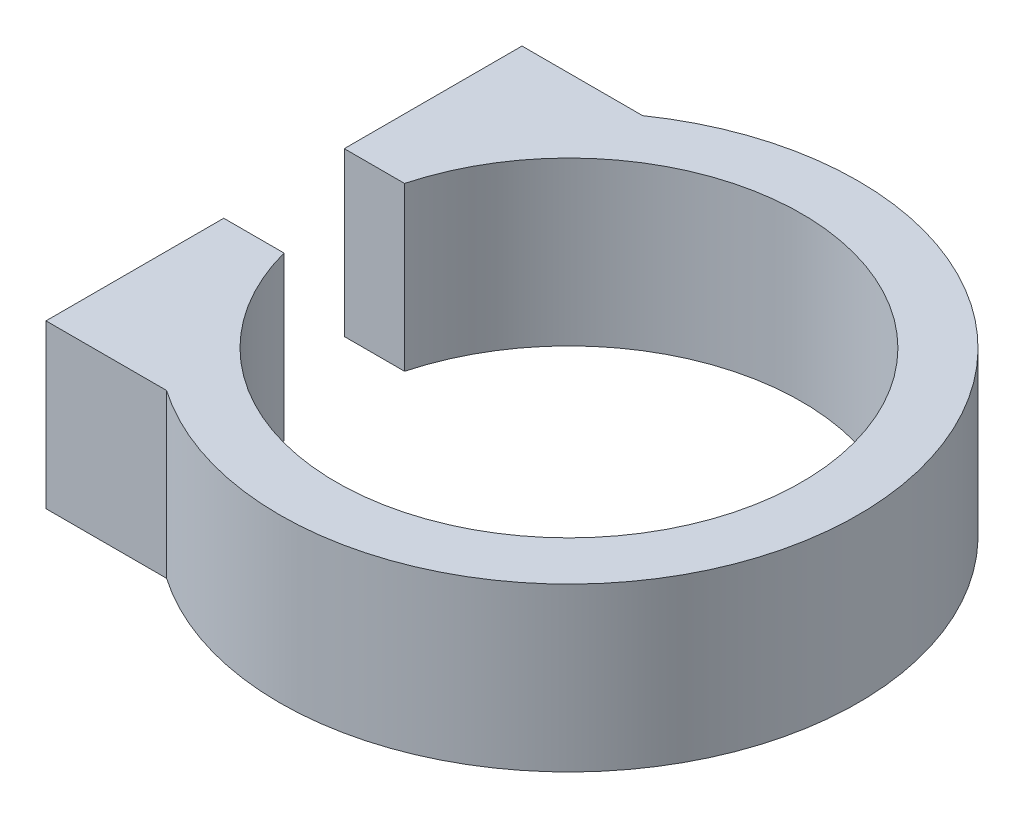
ISO-10303-21;
HEADER;
FILE_DESCRIPTION(('STEP AP214'),'2;1');
FILE_NAME('part.step','',(''),(''),'','','');
FILE_SCHEMA(('AUTOMOTIVE_DESIGN { 1 0 10303 214 1 1 1 1 }'));
ENDSEC;
DATA;
#1=APPLICATION_CONTEXT('core data for automotive mechanical design processes');
#2=APPLICATION_PROTOCOL_DEFINITION('international standard','automotive_design',2000,#1);
#3=PRODUCT_CONTEXT('',#1,'mechanical');
#4=PRODUCT('Part','Part','',(#3));
#5=PRODUCT_RELATED_PRODUCT_CATEGORY('part','',(#4));
#6=PRODUCT_DEFINITION_FORMATION('','',#4);
#7=PRODUCT_DEFINITION_CONTEXT('part definition',#1,'design');
#8=PRODUCT_DEFINITION('design','',#6,#7);
#9=PRODUCT_DEFINITION_SHAPE('','',#8);
#10=(LENGTH_UNIT() NAMED_UNIT(*) SI_UNIT(.MILLI.,.METRE.));
#11=(NAMED_UNIT(*) PLANE_ANGLE_UNIT() SI_UNIT($,.RADIAN.));
#12=(NAMED_UNIT(*) SI_UNIT($,.STERADIAN.) SOLID_ANGLE_UNIT());
#13=UNCERTAINTY_MEASURE_WITH_UNIT(LENGTH_MEASURE(1.E-05),#10,'distance_accuracy_value','');
#14=(GEOMETRIC_REPRESENTATION_CONTEXT(3) GLOBAL_UNCERTAINTY_ASSIGNED_CONTEXT((#13)) GLOBAL_UNIT_ASSIGNED_CONTEXT((#10,
#11,#12)) REPRESENTATION_CONTEXT('',''));
#15=CARTESIAN_POINT('',(0.,0.,0.));
#16=DIRECTION('',(0.,0.,1.));
#17=DIRECTION('',(1.,0.,0.));
#18=AXIS2_PLACEMENT_3D('',#15,#16,#17);
#19=CARTESIAN_POINT('',(0.,13.5,0.));
#20=DIRECTION('',(0.,-1.,0.));
#21=DIRECTION('',(0.,0.,-1.));
#22=AXIS2_PLACEMENT_3D('',#19,#20,#21);
#23=CYLINDRICAL_SURFACE('',#22,19.3);
#24=CARTESIAN_POINT('',(0.,0.,0.));
#25=DIRECTION('',(0.,-1.,0.));
#26=DIRECTION('',(0.,0.,-1.));
#27=AXIS2_PLACEMENT_3D('',#24,#25,#26);
#28=CIRCLE('',#27,19.3);
#29=CARTESIAN_POINT('',(-18.6410836594872,0.,-5.));
#30=VERTEX_POINT('',#29);
#31=CARTESIAN_POINT('',(-18.6410836594872,0.,5.));
#32=VERTEX_POINT('',#31);
#33=EDGE_CURVE('E144',#30,#32,#28,.T.);
#34=ORIENTED_EDGE('',*,*,#33,.T.);
#35=DIRECTION('',(0.,-1.,0.));
#36=VECTOR('',#35,1.);
#37=CARTESIAN_POINT('',(-18.6410836594872,13.5,5.));
#38=LINE('',#37,#36);
#39=CARTESIAN_POINT('',(-18.6410836594872,13.5,5.));
#40=VERTEX_POINT('',#39);
#41=EDGE_CURVE('E11',#40,#32,#38,.T.);
#42=ORIENTED_EDGE('',*,*,#41,.F.);
#43=CARTESIAN_POINT('',(0.,13.5,0.));
#44=DIRECTION('',(0.,-1.,0.));
#45=DIRECTION('',(0.,0.,-1.));
#46=AXIS2_PLACEMENT_3D('',#43,#44,#45);
#47=CIRCLE('',#46,19.3);
#48=CARTESIAN_POINT('',(-18.6410836594872,13.5,-5.));
#49=VERTEX_POINT('',#48);
#50=EDGE_CURVE('E166',#49,#40,#47,.T.);
#51=ORIENTED_EDGE('',*,*,#50,.F.);
#52=DIRECTION('',(0.,-1.,0.));
#53=VECTOR('',#52,1.);
#54=CARTESIAN_POINT('',(-18.6410836594872,13.5,-5.));
#55=LINE('',#54,#53);
#56=EDGE_CURVE('E140',#49,#30,#55,.T.);
#57=ORIENTED_EDGE('',*,*,#56,.T.);
#58=EDGE_LOOP('',(#34,#42,#51,#57));
#59=FACE_BOUND('',#58,.T.);
#60=ADVANCED_FACE('F43',(#59),#23,.F.);
#61=CARTESIAN_POINT('',(-18.6410836594872,13.5,5.));
#62=DIRECTION('',(0.,0.,1.));
#63=DIRECTION('',(1.,0.,0.));
#64=AXIS2_PLACEMENT_3D('',#61,#62,#63);
#65=PLANE('',#64);
#66=DIRECTION('',(-1.,0.,0.));
#67=VECTOR('',#66,1.);
#68=CARTESIAN_POINT('',(-18.6410836594872,0.,5.));
#69=LINE('',#68,#67);
#70=CARTESIAN_POINT('',(-23.6410836594872,0.,5.));
#71=VERTEX_POINT('',#70);
#72=EDGE_CURVE('E148',#32,#71,#69,.T.);
#73=ORIENTED_EDGE('',*,*,#72,.T.);
#74=DIRECTION('',(0.,-1.,0.));
#75=VECTOR('',#74,1.);
#76=CARTESIAN_POINT('',(-23.6410836594872,13.5,5.));
#77=LINE('',#76,#75);
#78=CARTESIAN_POINT('',(-23.6410836594872,13.5,5.));
#79=VERTEX_POINT('',#78);
#80=EDGE_CURVE('E52',#79,#71,#77,.T.);
#81=ORIENTED_EDGE('',*,*,#80,.F.);
#82=DIRECTION('',(-1.,0.,0.));
#83=VECTOR('',#82,1.);
#84=CARTESIAN_POINT('',(-18.6410836594872,13.5,5.));
#85=LINE('',#84,#83);
#86=EDGE_CURVE('E103',#40,#79,#85,.T.);
#87=ORIENTED_EDGE('',*,*,#86,.F.);
#88=ORIENTED_EDGE('',*,*,#41,.T.);
#89=EDGE_LOOP('',(#73,#81,#87,#88));
#90=FACE_BOUND('',#89,.T.);
#91=ADVANCED_FACE('F212',(#90),#65,.F.);
#92=CARTESIAN_POINT('',(-23.6410836594872,13.5,5.));
#93=DIRECTION('',(1.,0.,0.));
#94=DIRECTION('',(0.,0.,-1.));
#95=AXIS2_PLACEMENT_3D('',#92,#93,#94);
#96=PLANE('',#95);
#97=DIRECTION('',(0.,0.,1.));
#98=VECTOR('',#97,1.);
#99=CARTESIAN_POINT('',(-23.6410836594872,0.,5.));
#100=LINE('',#99,#98);
#101=CARTESIAN_POINT('',(-23.6410836594872,0.,19.7464132589914));
#102=VERTEX_POINT('',#101);
#103=EDGE_CURVE('E151',#71,#102,#100,.T.);
#104=ORIENTED_EDGE('',*,*,#103,.T.);
#105=DIRECTION('',(0.,-1.,0.));
#106=VECTOR('',#105,1.);
#107=CARTESIAN_POINT('',(-23.6410836594872,13.5,19.7464132589914));
#108=LINE('',#107,#106);
#109=CARTESIAN_POINT('',(-23.6410836594872,13.5,19.7464132589914));
#110=VERTEX_POINT('',#109);
#111=EDGE_CURVE('E177',#110,#102,#108,.T.);
#112=ORIENTED_EDGE('',*,*,#111,.F.);
#113=DIRECTION('',(0.,0.,1.));
#114=VECTOR('',#113,1.);
#115=CARTESIAN_POINT('',(-23.6410836594872,13.5,5.));
#116=LINE('',#115,#114);
#117=EDGE_CURVE('E187',#79,#110,#116,.T.);
#118=ORIENTED_EDGE('',*,*,#117,.F.);
#119=ORIENTED_EDGE('',*,*,#80,.T.);
#120=EDGE_LOOP('',(#104,#112,#118,#119));
#121=FACE_BOUND('',#120,.T.);
#122=ADVANCED_FACE('F185',(#121),#96,.F.);
#123=CARTESIAN_POINT('',(-23.6410836594872,13.5,19.7464132589914));
#124=DIRECTION('',(0.,0.,-1.));
#125=DIRECTION('',(-1.,0.,0.));
#126=AXIS2_PLACEMENT_3D('',#123,#124,#125);
#127=PLANE('',#126);
#128=DIRECTION('',(1.,0.,0.));
#129=VECTOR('',#128,1.);
#130=CARTESIAN_POINT('',(-23.6410836594872,0.,19.7464132589914));
#131=LINE('',#130,#129);
#132=CARTESIAN_POINT('',(-13.6410836594872,0.,19.7464132589914));
#133=VERTEX_POINT('',#132);
#134=EDGE_CURVE('E154',#102,#133,#131,.T.);
#135=ORIENTED_EDGE('',*,*,#134,.T.);
#136=DIRECTION('',(0.,-1.,0.));
#137=VECTOR('',#136,1.);
#138=CARTESIAN_POINT('',(-13.6410836594872,13.5,19.7464132589914));
#139=LINE('',#138,#137);
#140=CARTESIAN_POINT('',(-13.6410836594872,13.5,19.7464132589914));
#141=VERTEX_POINT('',#140);
#142=EDGE_CURVE('E173',#141,#133,#139,.T.);
#143=ORIENTED_EDGE('',*,*,#142,.F.);
#144=DIRECTION('',(1.,0.,0.));
#145=VECTOR('',#144,1.);
#146=CARTESIAN_POINT('',(-23.6410836594872,13.5,19.7464132589914));
#147=LINE('',#146,#145);
#148=EDGE_CURVE('E200',#110,#141,#147,.T.);
#149=ORIENTED_EDGE('',*,*,#148,.F.);
#150=ORIENTED_EDGE('',*,*,#111,.T.);
#151=EDGE_LOOP('',(#135,#143,#149,#150));
#152=FACE_BOUND('',#151,.T.);
#153=ADVANCED_FACE('F195',(#152),#127,.F.);
#154=CARTESIAN_POINT('',(0.,13.5,0.));
#155=DIRECTION('',(0.,-1.,0.));
#156=DIRECTION('',(0.,0.,-1.));
#157=AXIS2_PLACEMENT_3D('',#154,#155,#156);
#158=CYLINDRICAL_SURFACE('',#157,24.);
#159=CARTESIAN_POINT('',(0.,0.,0.));
#160=DIRECTION('',(0.,1.,0.));
#161=DIRECTION('',(0.,0.,-1.));
#162=AXIS2_PLACEMENT_3D('',#159,#160,#161);
#163=CIRCLE('',#162,24.);
#164=CARTESIAN_POINT('',(-13.6410836594872,0.,-19.7464132589914));
#165=VERTEX_POINT('',#164);
#166=EDGE_CURVE('E157',#133,#165,#163,.T.);
#167=ORIENTED_EDGE('',*,*,#166,.T.);
#168=DIRECTION('',(0.,-1.,0.));
#169=VECTOR('',#168,1.);
#170=CARTESIAN_POINT('',(-13.6410836594872,13.5,-19.7464132589914));
#171=LINE('',#170,#169);
#172=CARTESIAN_POINT('',(-13.6410836594872,13.5,-19.7464132589914));
#173=VERTEX_POINT('',#172);
#174=EDGE_CURVE('E133',#173,#165,#171,.T.);
#175=ORIENTED_EDGE('',*,*,#174,.F.);
#176=CARTESIAN_POINT('',(0.,13.5,0.));
#177=DIRECTION('',(0.,1.,0.));
#178=DIRECTION('',(0.,0.,-1.));
#179=AXIS2_PLACEMENT_3D('',#176,#177,#178);
#180=CIRCLE('',#179,24.);
#181=EDGE_CURVE('E122',#141,#173,#180,.T.);
#182=ORIENTED_EDGE('',*,*,#181,.F.);
#183=ORIENTED_EDGE('',*,*,#142,.T.);
#184=EDGE_LOOP('',(#167,#175,#182,#183));
#185=FACE_BOUND('',#184,.T.);
#186=ADVANCED_FACE('F198',(#185),#158,.T.);
#187=CARTESIAN_POINT('',(-23.6410836594872,13.5,-19.7464132589914));
#188=DIRECTION('',(0.,0.,1.));
#189=DIRECTION('',(1.,0.,0.));
#190=AXIS2_PLACEMENT_3D('',#187,#188,#189);
#191=PLANE('',#190);
#192=DIRECTION('',(-1.,0.,0.));
#193=VECTOR('',#192,1.);
#194=CARTESIAN_POINT('',(-23.6410836594872,0.,-19.7464132589914));
#195=LINE('',#194,#193);
#196=CARTESIAN_POINT('',(-23.6410836594872,0.,-19.7464132589914));
#197=VERTEX_POINT('',#196);
#198=EDGE_CURVE('E131',#165,#197,#195,.T.);
#199=ORIENTED_EDGE('',*,*,#198,.T.);
#200=DIRECTION('',(0.,-1.,0.));
#201=VECTOR('',#200,1.);
#202=CARTESIAN_POINT('',(-23.6410836594872,13.5,-19.7464132589914));
#203=LINE('',#202,#201);
#204=CARTESIAN_POINT('',(-23.6410836594872,13.5,-19.7464132589914));
#205=VERTEX_POINT('',#204);
#206=EDGE_CURVE('E128',#205,#197,#203,.T.);
#207=ORIENTED_EDGE('',*,*,#206,.F.);
#208=DIRECTION('',(-1.,0.,0.));
#209=VECTOR('',#208,1.);
#210=CARTESIAN_POINT('',(-23.6410836594872,13.5,-19.7464132589914));
#211=LINE('',#210,#209);
#212=EDGE_CURVE('E116',#173,#205,#211,.T.);
#213=ORIENTED_EDGE('',*,*,#212,.F.);
#214=ORIENTED_EDGE('',*,*,#174,.T.);
#215=EDGE_LOOP('',(#199,#207,#213,#214));
#216=FACE_BOUND('',#215,.T.);
#217=ADVANCED_FACE('F129',(#216),#191,.F.);
#218=CARTESIAN_POINT('',(-23.6410836594872,13.5,-5.));
#219=DIRECTION('',(1.,0.,0.));
#220=DIRECTION('',(0.,0.,-1.));
#221=AXIS2_PLACEMENT_3D('',#218,#219,#220);
#222=PLANE('',#221);
#223=DIRECTION('',(0.,0.,1.));
#224=VECTOR('',#223,1.);
#225=CARTESIAN_POINT('',(-23.6410836594872,0.,-5.));
#226=LINE('',#225,#224);
#227=CARTESIAN_POINT('',(-23.6410836594872,0.,-5.));
#228=VERTEX_POINT('',#227);
#229=EDGE_CURVE('E89',#197,#228,#226,.T.);
#230=ORIENTED_EDGE('',*,*,#229,.T.);
#231=DIRECTION('',(0.,-1.,0.));
#232=VECTOR('',#231,1.);
#233=CARTESIAN_POINT('',(-23.6410836594872,13.5,-5.));
#234=LINE('',#233,#232);
#235=CARTESIAN_POINT('',(-23.6410836594872,13.5,-5.));
#236=VERTEX_POINT('',#235);
#237=EDGE_CURVE('E134',#236,#228,#234,.T.);
#238=ORIENTED_EDGE('',*,*,#237,.F.);
#239=DIRECTION('',(0.,0.,1.));
#240=VECTOR('',#239,1.);
#241=CARTESIAN_POINT('',(-23.6410836594872,13.5,-5.));
#242=LINE('',#241,#240);
#243=EDGE_CURVE('E120',#205,#236,#242,.T.);
#244=ORIENTED_EDGE('',*,*,#243,.F.);
#245=ORIENTED_EDGE('',*,*,#206,.T.);
#246=EDGE_LOOP('',(#230,#238,#244,#245));
#247=FACE_BOUND('',#246,.T.);
#248=ADVANCED_FACE('F136',(#247),#222,.F.);
#249=CARTESIAN_POINT('',(-18.6410836594872,13.5,-5.));
#250=DIRECTION('',(0.,0.,-1.));
#251=DIRECTION('',(-1.,0.,0.));
#252=AXIS2_PLACEMENT_3D('',#249,#250,#251);
#253=PLANE('',#252);
#254=DIRECTION('',(1.,0.,0.));
#255=VECTOR('',#254,1.);
#256=CARTESIAN_POINT('',(-18.6410836594872,0.,-5.));
#257=LINE('',#256,#255);
#258=EDGE_CURVE('E95',#228,#30,#257,.T.);
#259=ORIENTED_EDGE('',*,*,#258,.T.);
#260=ORIENTED_EDGE('',*,*,#56,.F.);
#261=DIRECTION('',(1.,0.,0.));
#262=VECTOR('',#261,1.);
#263=CARTESIAN_POINT('',(-18.6410836594872,13.5,-5.));
#264=LINE('',#263,#262);
#265=EDGE_CURVE('E60',#236,#49,#264,.T.);
#266=ORIENTED_EDGE('',*,*,#265,.F.);
#267=ORIENTED_EDGE('',*,*,#237,.T.);
#268=EDGE_LOOP('',(#259,#260,#266,#267));
#269=FACE_BOUND('',#268,.T.);
#270=ADVANCED_FACE('F228',(#269),#253,.F.);
#271=CARTESIAN_POINT('',(0.,13.5,0.));
#272=DIRECTION('',(0.,-1.,0.));
#273=DIRECTION('',(0.,0.,-1.));
#274=AXIS2_PLACEMENT_3D('',#271,#272,#273);
#275=PLANE('',#274);
#276=ORIENTED_EDGE('',*,*,#50,.T.);
#277=ORIENTED_EDGE('',*,*,#86,.T.);
#278=ORIENTED_EDGE('',*,*,#117,.T.);
#279=ORIENTED_EDGE('',*,*,#148,.T.);
#280=ORIENTED_EDGE('',*,*,#181,.T.);
#281=ORIENTED_EDGE('',*,*,#212,.T.);
#282=ORIENTED_EDGE('',*,*,#243,.T.);
#283=ORIENTED_EDGE('',*,*,#265,.T.);
#284=EDGE_LOOP('',(#276,#277,#278,#279,#280,#281,#282,#283));
#285=FACE_BOUND('',#284,.T.);
#286=ADVANCED_FACE('F118',(#285),#275,.F.);
#287=CARTESIAN_POINT('',(0.,0.,0.));
#288=DIRECTION('',(0.,-1.,0.));
#289=DIRECTION('',(0.,0.,-1.));
#290=AXIS2_PLACEMENT_3D('',#287,#288,#289);
#291=PLANE('',#290);
#292=ORIENTED_EDGE('',*,*,#33,.F.);
#293=ORIENTED_EDGE('',*,*,#258,.F.);
#294=ORIENTED_EDGE('',*,*,#229,.F.);
#295=ORIENTED_EDGE('',*,*,#198,.F.);
#296=ORIENTED_EDGE('',*,*,#166,.F.);
#297=ORIENTED_EDGE('',*,*,#134,.F.);
#298=ORIENTED_EDGE('',*,*,#103,.F.);
#299=ORIENTED_EDGE('',*,*,#72,.F.);
#300=EDGE_LOOP('',(#292,#293,#294,#295,#296,#297,#298,#299));
#301=FACE_BOUND('',#300,.T.);
#302=ADVANCED_FACE('F191',(#301),#291,.T.);
#303=CLOSED_SHELL('',(#60,#91,#122,#153,#186,#217,#248,#270,#286,#302));
#304=MANIFOLD_SOLID_BREP('B2',#303);
#305=ADVANCED_BREP_SHAPE_REPRESENTATION('',(#18,#304),#14);
#306=SHAPE_DEFINITION_REPRESENTATION(#9,#305);
ENDSEC;
END-ISO-10303-21;
